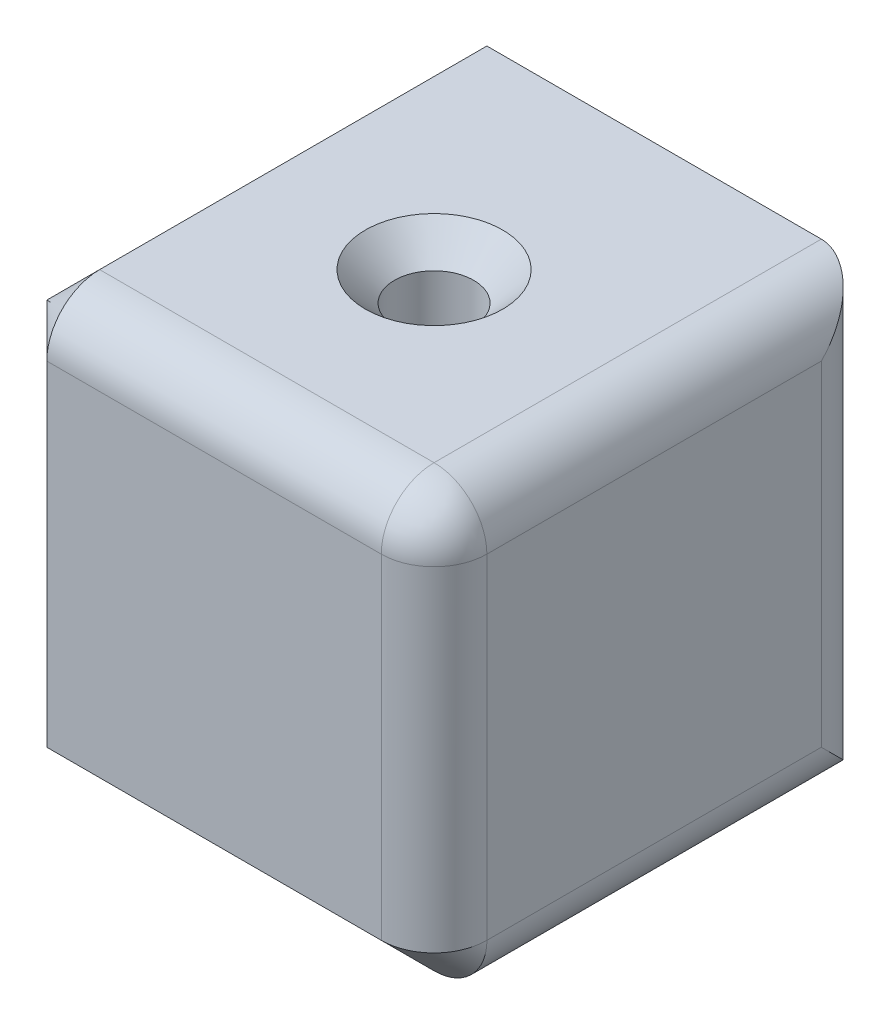
ISO-10303-21;
HEADER;
FILE_DESCRIPTION(('STEP AP214'),'2;1');
FILE_NAME('part.step','',(''),(''),'','','');
FILE_SCHEMA(('AUTOMOTIVE_DESIGN { 1 0 10303 214 1 1 1 1 }'));
ENDSEC;
DATA;
#1=APPLICATION_CONTEXT('core data for automotive mechanical design processes');
#2=APPLICATION_PROTOCOL_DEFINITION('international standard','automotive_design',2000,#1);
#3=PRODUCT_CONTEXT('',#1,'mechanical');
#4=PRODUCT('Part','Part','',(#3));
#5=PRODUCT_RELATED_PRODUCT_CATEGORY('part','',(#4));
#6=PRODUCT_DEFINITION_FORMATION('','',#4);
#7=PRODUCT_DEFINITION_CONTEXT('part definition',#1,'design');
#8=PRODUCT_DEFINITION('design','',#6,#7);
#9=PRODUCT_DEFINITION_SHAPE('','',#8);
#10=(LENGTH_UNIT() NAMED_UNIT(*) SI_UNIT(.MILLI.,.METRE.));
#11=(NAMED_UNIT(*) PLANE_ANGLE_UNIT() SI_UNIT($,.RADIAN.));
#12=(NAMED_UNIT(*) SI_UNIT($,.STERADIAN.) SOLID_ANGLE_UNIT());
#13=UNCERTAINTY_MEASURE_WITH_UNIT(LENGTH_MEASURE(1.E-05),#10,'distance_accuracy_value','');
#14=(GEOMETRIC_REPRESENTATION_CONTEXT(3) GLOBAL_UNCERTAINTY_ASSIGNED_CONTEXT((#13)) GLOBAL_UNIT_ASSIGNED_CONTEXT((#10,
#11,#12)) REPRESENTATION_CONTEXT('',''));
#15=CARTESIAN_POINT('',(0.,0.,0.));
#16=DIRECTION('',(0.,0.,1.));
#17=DIRECTION('',(1.,0.,0.));
#18=AXIS2_PLACEMENT_3D('',#15,#16,#17);
#19=CARTESIAN_POINT('',(0.,0.,25.));
#20=DIRECTION('',(1.,0.,0.));
#21=DIRECTION('',(0.,0.,-1.));
#22=AXIS2_PLACEMENT_3D('',#19,#20,#21);
#23=PLANE('',#22);
#24=DIRECTION('',(0.,0.,-1.));
#25=VECTOR('',#24,1.);
#26=CARTESIAN_POINT('',(0.,22.,25.));
#27=LINE('',#26,#25);
#28=CARTESIAN_POINT('',(0.,22.,22.));
#29=VERTEX_POINT('',#28);
#30=CARTESIAN_POINT('',(0.,22.,2.));
#31=VERTEX_POINT('',#30);
#32=EDGE_CURVE('E391',#29,#31,#27,.T.);
#33=ORIENTED_EDGE('',*,*,#32,.T.);
#34=CARTESIAN_POINT('',(0.,71.9999999999998,2.));
#35=CARTESIAN_POINT('',(0.,56.7333333333332,2.));
#36=CARTESIAN_POINT('',(0.,41.4666666666666,2.));
#37=CARTESIAN_POINT('',(0.,26.2,2.));
#38=CARTESIAN_POINT('',(0.,24.8,2.));
#39=CARTESIAN_POINT('',(0.,23.4,2.));
#40=CARTESIAN_POINT('',(0.,22.,2.));
#41=CARTESIAN_POINT('',(0.,14.6666666666667,2.));
#42=CARTESIAN_POINT('',(0.,7.33333333333329,4.));
#43=CARTESIAN_POINT('',(0.,0.,4.));
#44=CARTESIAN_POINT('',(0.,-0.733333333333367,4.));
#45=CARTESIAN_POINT('',(0.,-1.46666666666673,4.));
#46=CARTESIAN_POINT('',(0.,-2.2000000000001,4.));
#47=CARTESIAN_POINT('',(0.,-17.4666666666666,4.));
#48=CARTESIAN_POINT('',(0.,-32.7333333333331,4.));
#49=CARTESIAN_POINT('',(0.,-47.9999999999996,4.));
#50=(BOUNDED_CURVE() B_SPLINE_CURVE(3,(#34,#35,#36,#37,#38,#39,#40,#41,#42,#43,#44,#45,#46,#47,
#48,#49),.UNSPECIFIED.,.F.,.F.) B_SPLINE_CURVE_WITH_KNOTS((4,3,3,3,3,4),(-1.61267605633802,0.,
0.147887323943662,0.922535211267602,1.,2.61267605633802),
.UNSPECIFIED.) CURVE() GEOMETRIC_REPRESENTATION_ITEM() RATIONAL_B_SPLINE_CURVE((1.,1.,1.,1.,1.,
1.,1.,1.,1.,1.,1.,1.,1.,1.,1.,1.)) REPRESENTATION_ITEM(''));
#51=CARTESIAN_POINT('',(0.,0.,4.));
#52=VERTEX_POINT('',#51);
#53=EDGE_CURVE('E258',#31,#52,#50,.T.);
#54=ORIENTED_EDGE('',*,*,#53,.T.);
#55=DIRECTION('',(0.,0.,-1.));
#56=VECTOR('',#55,1.);
#57=CARTESIAN_POINT('',(0.,0.,25.));
#58=LINE('',#57,#56);
#59=CARTESIAN_POINT('',(0.,0.,22.));
#60=VERTEX_POINT('',#59);
#61=EDGE_CURVE('E156',#60,#52,#58,.T.);
#62=ORIENTED_EDGE('',*,*,#61,.F.);
#63=DIRECTION('',(0.,1.,0.));
#64=VECTOR('',#63,1.);
#65=CARTESIAN_POINT('',(0.,0.,22.));
#66=LINE('',#65,#64);
#67=EDGE_CURVE('E400',#60,#29,#66,.T.);
#68=ORIENTED_EDGE('',*,*,#67,.T.);
#69=EDGE_LOOP('',(#33,#54,#62,#68));
#70=FACE_BOUND('',#69,.T.);
#71=ADVANCED_FACE('F48',(#70),#23,.F.);
#72=CARTESIAN_POINT('',(0.,0.,25.));
#73=DIRECTION('',(0.,1.,0.));
#74=DIRECTION('',(0.,0.,1.));
#75=AXIS2_PLACEMENT_3D('',#72,#73,#74);
#76=PLANE('',#75);
#77=CARTESIAN_POINT('',(12.5,0.,12.5));
#78=DIRECTION('',(0.,1.,0.));
#79=DIRECTION('',(0.,0.,1.));
#80=AXIS2_PLACEMENT_3D('',#77,#78,#79);
#81=CIRCLE('',#80,2.25);
#82=CARTESIAN_POINT('',(12.5,0.,14.75));
#83=VERTEX_POINT('',#82);
#84=EDGE_CURVE('E224',#83,#83,#81,.T.);
#85=ORIENTED_EDGE('',*,*,#84,.T.);
#86=EDGE_LOOP('',(#85));
#87=FACE_BOUND('',#86,.T.);
#88=ORIENTED_EDGE('',*,*,#61,.T.);
#89=CARTESIAN_POINT('',(0.,0.,4.));
#90=CARTESIAN_POINT('',(-1.0780165005591E-05,0.,3.88749351533069));
#91=CARTESIAN_POINT('',(0.00474660216352319,0.,3.77499214031857));
#92=CARTESIAN_POINT('',(0.0237142676639781,0.,3.55079431915907));
#93=CARTESIAN_POINT('',(0.0379240973845999,0.,3.43909783465941));
#94=CARTESIAN_POINT('',(0.075698971357286,0.,3.2173773587357));
#95=CARTESIAN_POINT('',(0.0992569385308707,0.,3.10735216732035));
#96=CARTESIAN_POINT('',(0.155536996447877,0.,2.88970424637514));
#97=CARTESIAN_POINT('',(0.188258975324464,0.,2.78208148753564));
#98=CARTESIAN_POINT('',(0.299906592833125,0.,2.4638552761497));
#99=CARTESIAN_POINT('',(0.392329366770348,0.,2.2578036601231));
#100=CARTESIAN_POINT('',(0.610395015416491,0.,1.86429305281761));
#101=CARTESIAN_POINT('',(0.73603203798121,0.,1.67683079420277));
#102=CARTESIAN_POINT('',(1.01700181102197,0.,1.325628419682));
#103=CARTESIAN_POINT('',(1.17233427169146,0.,1.16188807229434));
#104=CARTESIAN_POINT('',(1.50831732546924,0.,0.862784943115789));
#105=CARTESIAN_POINT('',(1.68897286554306,0.,0.727427719008998));
#106=CARTESIAN_POINT('',(2.07046311746318,0.,0.488943692525064));
#107=CARTESIAN_POINT('',(2.27130176975454,0.,0.38582320009609));
#108=CARTESIAN_POINT('',(2.68740125719416,0.,0.214817855130699));
#109=CARTESIAN_POINT('',(2.90265356163622,0.,0.146912365149823));
#110=CARTESIAN_POINT('',(3.2660192610585,0.,0.0651394785829526));
#111=CARTESIAN_POINT('',(3.41184681111315,0.,0.0407269308072329));
#112=CARTESIAN_POINT('',(3.70509586554667,0.,0.0081593277305874));
#113=CARTESIAN_POINT('',(3.8525148110416,0.,-1.87754480882476E-05));
#114=CARTESIAN_POINT('',(4.,0.,0.));
#115=B_SPLINE_CURVE_WITH_KNOTS('',3,(#89,#90,#91,#92,#93,#94,#95,#96,#97,#98,#99,#100,#101,#102,
#103,#104,#105,#106,#107,#108,#109,#110,#111,#112,#113,#114),.UNSPECIFIED.,.F.,.F.,(4,2,2,2,2,2,
2,2,2,2,2,2,4),(0.,0.337409690213685,0.674803195430493,1.01194176015819,1.34907620955064,
2.0230739401627,2.69695299561842,3.37082547482512,4.04482978167746,4.71896593419016,
5.39270656736782,5.83543557899262,6.27753560189516),.UNSPECIFIED.);
#116=CARTESIAN_POINT('',(4.,0.,0.));
#117=VERTEX_POINT('',#116);
#118=EDGE_CURVE('E79',#52,#117,#115,.T.);
#119=ORIENTED_EDGE('',*,*,#118,.T.);
#120=DIRECTION('',(1.,0.,0.));
#121=VECTOR('',#120,1.);
#122=CARTESIAN_POINT('',(0.,0.,0.));
#123=LINE('',#122,#121);
#124=CARTESIAN_POINT('',(22.,0.,0.));
#125=VERTEX_POINT('',#124);
#126=EDGE_CURVE('E219',#117,#125,#123,.T.);
#127=ORIENTED_EDGE('',*,*,#126,.T.);
#128=DIRECTION('',(0.,0.,-1.));
#129=VECTOR('',#128,1.);
#130=CARTESIAN_POINT('',(22.,0.,25.));
#131=LINE('',#130,#129);
#132=CARTESIAN_POINT('',(22.,0.,22.));
#133=VERTEX_POINT('',#132);
#134=EDGE_CURVE('E143',#125,#133,#131,.F.);
#135=ORIENTED_EDGE('',*,*,#134,.T.);
#136=DIRECTION('',(-1.,0.,0.));
#137=VECTOR('',#136,1.);
#138=CARTESIAN_POINT('',(0.,0.,22.));
#139=LINE('',#138,#137);
#140=EDGE_CURVE('E399',#133,#60,#139,.T.);
#141=ORIENTED_EDGE('',*,*,#140,.T.);
#142=EDGE_LOOP('',(#88,#119,#127,#135,#141));
#143=FACE_BOUND('',#142,.T.);
#144=ADVANCED_FACE('F349',(#87,#143),#76,.F.);
#145=CARTESIAN_POINT('',(25.,0.,25.));
#146=DIRECTION('',(-1.,0.,0.));
#147=DIRECTION('',(0.,0.,1.));
#148=AXIS2_PLACEMENT_3D('',#145,#146,#147);
#149=PLANE('',#148);
#150=DIRECTION('',(0.,1.,0.));
#151=VECTOR('',#150,1.);
#152=CARTESIAN_POINT('',(25.,0.,22.));
#153=LINE('',#152,#151);
#154=CARTESIAN_POINT('',(25.,22.,22.));
#155=VERTEX_POINT('',#154);
#156=CARTESIAN_POINT('',(25.,3.,22.));
#157=VERTEX_POINT('',#156);
#158=EDGE_CURVE('E161',#155,#157,#153,.F.);
#159=ORIENTED_EDGE('',*,*,#158,.T.);
#160=DIRECTION('',(0.,0.,-1.));
#161=VECTOR('',#160,1.);
#162=CARTESIAN_POINT('',(25.,3.,25.));
#163=LINE('',#162,#161);
#164=CARTESIAN_POINT('',(25.,3.,3.));
#165=VERTEX_POINT('',#164);
#166=EDGE_CURVE('E140',#157,#165,#163,.T.);
#167=ORIENTED_EDGE('',*,*,#166,.T.);
#168=DIRECTION('',(0.,1.,0.));
#169=VECTOR('',#168,1.);
#170=CARTESIAN_POINT('',(25.,25.,3.));
#171=LINE('',#170,#169);
#172=CARTESIAN_POINT('',(25.,22.,3.));
#173=VERTEX_POINT('',#172);
#174=EDGE_CURVE('E149',#165,#173,#171,.T.);
#175=ORIENTED_EDGE('',*,*,#174,.T.);
#176=DIRECTION('',(0.,0.,-1.));
#177=VECTOR('',#176,1.);
#178=CARTESIAN_POINT('',(25.,22.,25.));
#179=LINE('',#178,#177);
#180=EDGE_CURVE('E154',#173,#155,#179,.F.);
#181=ORIENTED_EDGE('',*,*,#180,.T.);
#182=EDGE_LOOP('',(#159,#167,#175,#181));
#183=FACE_BOUND('',#182,.T.);
#184=ADVANCED_FACE('F157',(#183),#149,.F.);
#185=CARTESIAN_POINT('',(0.,25.,25.));
#186=DIRECTION('',(0.,-1.,0.));
#187=DIRECTION('',(0.,0.,-1.));
#188=AXIS2_PLACEMENT_3D('',#185,#186,#187);
#189=PLANE('',#188);
#190=CARTESIAN_POINT('',(12.5,25.,12.5));
#191=DIRECTION('',(0.,1.,0.));
#192=DIRECTION('',(0.,0.,1.));
#193=AXIS2_PLACEMENT_3D('',#190,#191,#192);
#194=CIRCLE('',#193,3.9);
#195=CARTESIAN_POINT('',(12.5,25.,16.4));
#196=VERTEX_POINT('',#195);
#197=EDGE_CURVE('E210',#196,#196,#194,.T.);
#198=ORIENTED_EDGE('',*,*,#197,.F.);
#199=EDGE_LOOP('',(#198));
#200=FACE_BOUND('',#199,.T.);
#201=DIRECTION('',(-1.,0.,0.));
#202=VECTOR('',#201,1.);
#203=CARTESIAN_POINT('',(0.,25.,0.));
#204=LINE('',#203,#202);
#205=CARTESIAN_POINT('',(22.,25.,0.));
#206=VERTEX_POINT('',#205);
#207=CARTESIAN_POINT('',(3.00000000000001,25.,0.));
#208=VERTEX_POINT('',#207);
#209=EDGE_CURVE('E216',#206,#208,#204,.T.);
#210=ORIENTED_EDGE('',*,*,#209,.T.);
#211=DIRECTION('',(0.,0.,1.));
#212=VECTOR('',#211,1.);
#213=CARTESIAN_POINT('',(3.00000000000001,25.,25.));
#214=LINE('',#213,#212);
#215=CARTESIAN_POINT('',(3.00000000000001,25.,22.));
#216=VERTEX_POINT('',#215);
#217=EDGE_CURVE('E244',#208,#216,#214,.T.);
#218=ORIENTED_EDGE('',*,*,#217,.T.);
#219=DIRECTION('',(-1.,0.,0.));
#220=VECTOR('',#219,1.);
#221=CARTESIAN_POINT('',(0.,25.,22.));
#222=LINE('',#221,#220);
#223=CARTESIAN_POINT('',(22.,25.,22.));
#224=VERTEX_POINT('',#223);
#225=EDGE_CURVE('E176',#216,#224,#222,.F.);
#226=ORIENTED_EDGE('',*,*,#225,.T.);
#227=DIRECTION('',(0.,0.,-1.));
#228=VECTOR('',#227,1.);
#229=CARTESIAN_POINT('',(22.,25.,25.));
#230=LINE('',#229,#228);
#231=EDGE_CURVE('E188',#224,#206,#230,.T.);
#232=ORIENTED_EDGE('',*,*,#231,.T.);
#233=EDGE_LOOP('',(#210,#218,#226,#232));
#234=FACE_BOUND('',#233,.T.);
#235=ADVANCED_FACE('F240',(#200,#234),#189,.F.);
#236=CARTESIAN_POINT('',(0.,0.,25.));
#237=DIRECTION('',(0.,0.,-1.));
#238=DIRECTION('',(-1.,0.,0.));
#239=AXIS2_PLACEMENT_3D('',#236,#237,#238);
#240=PLANE('',#239);
#241=DIRECTION('',(-1.,0.,0.));
#242=VECTOR('',#241,1.);
#243=CARTESIAN_POINT('',(0.,22.,25.));
#244=LINE('',#243,#242);
#245=CARTESIAN_POINT('',(22.,22.,25.));
#246=VERTEX_POINT('',#245);
#247=CARTESIAN_POINT('',(3.00000000000001,22.,25.));
#248=VERTEX_POINT('',#247);
#249=EDGE_CURVE('E167',#246,#248,#244,.T.);
#250=ORIENTED_EDGE('',*,*,#249,.T.);
#251=DIRECTION('',(0.,-1.,0.));
#252=VECTOR('',#251,1.);
#253=CARTESIAN_POINT('',(3.00000000000001,0.,25.));
#254=LINE('',#253,#252);
#255=CARTESIAN_POINT('',(3.00000000000001,3.00000000000001,25.));
#256=VERTEX_POINT('',#255);
#257=EDGE_CURVE('E389',#248,#256,#254,.T.);
#258=ORIENTED_EDGE('',*,*,#257,.T.);
#259=DIRECTION('',(1.,0.,0.));
#260=VECTOR('',#259,1.);
#261=CARTESIAN_POINT('',(0.,3.00000000000001,25.));
#262=LINE('',#261,#260);
#263=CARTESIAN_POINT('',(22.,3.00000000000001,25.));
#264=VERTEX_POINT('',#263);
#265=EDGE_CURVE('E379',#256,#264,#262,.T.);
#266=ORIENTED_EDGE('',*,*,#265,.T.);
#267=DIRECTION('',(0.,1.,0.));
#268=VECTOR('',#267,1.);
#269=CARTESIAN_POINT('',(22.,0.,25.));
#270=LINE('',#269,#268);
#271=EDGE_CURVE('E174',#264,#246,#270,.T.);
#272=ORIENTED_EDGE('',*,*,#271,.T.);
#273=EDGE_LOOP('',(#250,#258,#266,#272));
#274=FACE_BOUND('',#273,.T.);
#275=ADVANCED_FACE('F238',(#274),#240,.F.);
#276=CARTESIAN_POINT('',(0.,0.,0.));
#277=DIRECTION('',(0.,0.,-1.));
#278=DIRECTION('',(-1.,0.,0.));
#279=AXIS2_PLACEMENT_3D('',#276,#277,#278);
#280=PLANE('',#279);
#281=ORIENTED_EDGE('',*,*,#126,.F.);
#282=CARTESIAN_POINT('',(2.,71.9999999999998,0.));
#283=CARTESIAN_POINT('',(2.,56.7333333333332,0.));
#284=CARTESIAN_POINT('',(2.,41.4666666666666,0.));
#285=CARTESIAN_POINT('',(2.,26.2,0.));
#286=CARTESIAN_POINT('',(2.,24.8,0.));
#287=CARTESIAN_POINT('',(2.,23.4,0.));
#288=CARTESIAN_POINT('',(2.,22.,0.));
#289=CARTESIAN_POINT('',(2.,14.6666666666667,0.));
#290=CARTESIAN_POINT('',(4.,7.33333333333329,0.));
#291=CARTESIAN_POINT('',(4.,0.,0.));
#292=CARTESIAN_POINT('',(4.,-0.733333333333367,0.));
#293=CARTESIAN_POINT('',(4.,-1.46666666666673,0.));
#294=CARTESIAN_POINT('',(4.,-2.2000000000001,0.));
#295=CARTESIAN_POINT('',(4.,-17.4666666666666,0.));
#296=CARTESIAN_POINT('',(4.,-32.7333333333331,0.));
#297=CARTESIAN_POINT('',(4.,-47.9999999999996,0.));
#298=(BOUNDED_CURVE() B_SPLINE_CURVE(3,(#282,#283,#284,#285,#286,#287,#288,#289,#290,#291,#292,
#293,#294,#295,#296,#297),.UNSPECIFIED.,.F.,.F.) B_SPLINE_CURVE_WITH_KNOTS((4,3,3,3,3,4),
(-1.61267605633802,0.,0.147887323943662,0.922535211267602,1.,2.61267605633802),
.UNSPECIFIED.) CURVE() GEOMETRIC_REPRESENTATION_ITEM() RATIONAL_B_SPLINE_CURVE((1.,1.,1.,1.,1.,
1.,1.,1.,1.,1.,1.,1.,1.,1.,1.,1.)) REPRESENTATION_ITEM(''));
#299=CARTESIAN_POINT('',(2.,24.,0.));
#300=VERTEX_POINT('',#299);
#301=EDGE_CURVE('E62',#117,#300,#298,.F.);
#302=ORIENTED_EDGE('',*,*,#301,.T.);
#303=DIRECTION('',(-0.707106781186548,-0.707106781186548,0.));
#304=VECTOR('',#303,1.);
#305=CARTESIAN_POINT('',(-11.,11.,0.));
#306=LINE('',#305,#304);
#307=EDGE_CURVE('E248',#300,#208,#306,.F.);
#308=ORIENTED_EDGE('',*,*,#307,.T.);
#309=ORIENTED_EDGE('',*,*,#209,.F.);
#310=DIRECTION('',(0.,1.,0.));
#311=VECTOR('',#310,1.);
#312=CARTESIAN_POINT('',(22.,0.,0.));
#313=LINE('',#312,#311);
#314=EDGE_CURVE('E189',#206,#125,#313,.F.);
#315=ORIENTED_EDGE('',*,*,#314,.T.);
#316=EDGE_LOOP('',(#281,#302,#308,#309,#315));
#317=FACE_BOUND('',#316,.T.);
#318=ADVANCED_FACE('F430',(#317),#280,.T.);
#319=CARTESIAN_POINT('',(12.5,25.,12.5));
#320=DIRECTION('',(0.,1.,0.));
#321=DIRECTION('',(0.,0.,1.));
#322=AXIS2_PLACEMENT_3D('',#319,#320,#321);
#323=CYLINDRICAL_SURFACE('',#322,2.25);
#324=ORIENTED_EDGE('',*,*,#84,.F.);
#325=EDGE_LOOP('',(#324));
#326=FACE_BOUND('',#325,.T.);
#327=CARTESIAN_POINT('',(12.5,23.35,12.5));
#328=DIRECTION('',(0.,1.,0.));
#329=DIRECTION('',(0.,0.,1.));
#330=AXIS2_PLACEMENT_3D('',#327,#328,#329);
#331=CIRCLE('',#330,2.25);
#332=CARTESIAN_POINT('',(12.5,23.35,14.75));
#333=VERTEX_POINT('',#332);
#334=EDGE_CURVE('E230',#333,#333,#331,.T.);
#335=ORIENTED_EDGE('',*,*,#334,.T.);
#336=EDGE_LOOP('',(#335));
#337=FACE_BOUND('',#336,.T.);
#338=ADVANCED_FACE('F455',(#326,#337),#323,.F.);
#339=CARTESIAN_POINT('',(12.5,25.,12.5));
#340=DIRECTION('',(0.,1.,0.));
#341=DIRECTION('',(0.,0.,1.));
#342=AXIS2_PLACEMENT_3D('',#339,#340,#341);
#343=CONICAL_SURFACE('',#342,3.9,0.785398163397444);
#344=ORIENTED_EDGE('',*,*,#334,.F.);
#345=EDGE_LOOP('',(#344));
#346=FACE_BOUND('',#345,.T.);
#347=ORIENTED_EDGE('',*,*,#197,.T.);
#348=EDGE_LOOP('',(#347));
#349=FACE_BOUND('',#348,.T.);
#350=ADVANCED_FACE('F234',(#346,#349),#343,.F.);
#351=CARTESIAN_POINT('',(0.,22.,22.));
#352=DIRECTION('',(-1.,0.,0.));
#353=DIRECTION('',(0.,0.,1.));
#354=AXIS2_PLACEMENT_3D('',#351,#352,#353);
#355=CYLINDRICAL_SURFACE('',#354,3.);
#356=ORIENTED_EDGE('',*,*,#225,.F.);
#357=CARTESIAN_POINT('',(3.00000000000001,22.,22.));
#358=DIRECTION('',(1.,0.,0.));
#359=DIRECTION('',(0.,0.,-1.));
#360=AXIS2_PLACEMENT_3D('',#357,#358,#359);
#361=CIRCLE('',#360,3.);
#362=EDGE_CURVE('E265',#216,#248,#361,.T.);
#363=ORIENTED_EDGE('',*,*,#362,.T.);
#364=ORIENTED_EDGE('',*,*,#249,.F.);
#365=CARTESIAN_POINT('',(22.,22.,22.));
#366=DIRECTION('',(1.,0.,0.));
#367=DIRECTION('',(0.,0.,-1.));
#368=AXIS2_PLACEMENT_3D('',#365,#366,#367);
#369=CIRCLE('',#368,3.);
#370=EDGE_CURVE('E204',#224,#246,#369,.T.);
#371=ORIENTED_EDGE('',*,*,#370,.F.);
#372=EDGE_LOOP('',(#356,#363,#364,#371));
#373=FACE_BOUND('',#372,.T.);
#374=ADVANCED_FACE('F406',(#373),#355,.T.);
#375=CARTESIAN_POINT('',(22.,22.,22.));
#376=DIRECTION('',(0.,1.,0.));
#377=DIRECTION('',(0.,0.,1.));
#378=AXIS2_PLACEMENT_3D('',#375,#376,#377);
#379=SPHERICAL_SURFACE('',#378,3.);
#380=CARTESIAN_POINT('',(22.,22.,22.));
#381=DIRECTION('',(0.,1.,0.));
#382=DIRECTION('',(0.,0.,1.));
#383=AXIS2_PLACEMENT_3D('',#380,#381,#382);
#384=CIRCLE('',#383,3.);
#385=EDGE_CURVE('E198',#155,#246,#384,.F.);
#386=ORIENTED_EDGE('',*,*,#385,.F.);
#387=CARTESIAN_POINT('',(22.,22.,22.));
#388=DIRECTION('',(0.,0.,1.));
#389=DIRECTION('',(1.,0.,0.));
#390=AXIS2_PLACEMENT_3D('',#387,#388,#389);
#391=CIRCLE('',#390,3.);
#392=EDGE_CURVE('E199',#224,#155,#391,.F.);
#393=ORIENTED_EDGE('',*,*,#392,.F.);
#394=ORIENTED_EDGE('',*,*,#370,.T.);
#395=EDGE_LOOP('',(#386,#393,#394));
#396=FACE_BOUND('',#395,.T.);
#397=ADVANCED_FACE('F422',(#396),#379,.T.);
#398=CARTESIAN_POINT('',(22.,22.,25.));
#399=DIRECTION('',(0.,0.,-1.));
#400=DIRECTION('',(-1.,0.,0.));
#401=AXIS2_PLACEMENT_3D('',#398,#399,#400);
#402=CYLINDRICAL_SURFACE('',#401,3.);
#403=ORIENTED_EDGE('',*,*,#392,.T.);
#404=ORIENTED_EDGE('',*,*,#180,.F.);
#405=CARTESIAN_POINT('',(22.,22.,3.));
#406=DIRECTION('',(0.,-0.707106781186547,-0.707106781186547));
#407=DIRECTION('',(0.,-0.707106781186547,0.707106781186547));
#408=AXIS2_PLACEMENT_3D('',#405,#406,#407);
#409=ELLIPSE('',#408,4.24264068711928,3.);
#410=EDGE_CURVE('E144',#206,#173,#409,.T.);
#411=ORIENTED_EDGE('',*,*,#410,.F.);
#412=ORIENTED_EDGE('',*,*,#231,.F.);
#413=EDGE_LOOP('',(#403,#404,#411,#412));
#414=FACE_BOUND('',#413,.T.);
#415=ADVANCED_FACE('F372',(#414),#402,.T.);
#416=CARTESIAN_POINT('',(22.,0.,22.));
#417=DIRECTION('',(0.,1.,0.));
#418=DIRECTION('',(0.,0.,1.));
#419=AXIS2_PLACEMENT_3D('',#416,#417,#418);
#420=CYLINDRICAL_SURFACE('',#419,3.);
#421=ORIENTED_EDGE('',*,*,#271,.F.);
#422=CARTESIAN_POINT('',(25.,3.,22.));
#423=CARTESIAN_POINT('',(25.,3.,22.2778977561766));
#424=CARTESIAN_POINT('',(24.9603489607797,3.,22.554878178305));
#425=CARTESIAN_POINT('',(24.815474528059,3.,23.0698873511729));
#426=CARTESIAN_POINT('',(24.7109932523984,3.,23.3073564895324));
#427=CARTESIAN_POINT('',(24.4661440043677,3.,23.7253403012141));
#428=CARTESIAN_POINT('',(24.3262255694513,3.,23.9062260862826));
#429=CARTESIAN_POINT('',(24.0347585257967,3.,24.2146740242508));
#430=CARTESIAN_POINT('',(23.883200754588,3.,24.34261059027));
#431=CARTESIAN_POINT('',(23.5809008605497,3.,24.5563688952964));
#432=CARTESIAN_POINT('',(23.4300193540044,3.,24.6423472302576));
#433=CARTESIAN_POINT('',(23.1331336914065,3.,24.7826178816856));
#434=CARTESIAN_POINT('',(22.9870236855326,3.,24.8369397553792));
#435=CARTESIAN_POINT('',(22.5557143683683,3.,24.9632673295877));
#436=CARTESIAN_POINT('',(22.2775127693529,3.,25.));
#437=CARTESIAN_POINT('',(22.,3.,25.));
#438=B_SPLINE_CURVE_WITH_KNOTS('',3,(#422,#423,#424,#425,#426,#427,#428,#429,#430,#431,#432,
#433,#434,#435,#436,#437),.UNSPECIFIED.,.F.,.F.,(4,2,2,2,2,2,2,4),(1.5707963267949,
1.76714586764426,1.96349540849362,2.15984494934298,2.35619449019235,2.55254403104171,
2.74889357189107,3.14159265358979),.UNSPECIFIED.);
#439=EDGE_CURVE('E330',#264,#157,#438,.F.);
#440=ORIENTED_EDGE('',*,*,#439,.T.);
#441=ORIENTED_EDGE('',*,*,#158,.F.);
#442=ORIENTED_EDGE('',*,*,#385,.T.);
#443=EDGE_LOOP('',(#421,#440,#441,#442));
#444=FACE_BOUND('',#443,.T.);
#445=ADVANCED_FACE('F367',(#444),#420,.T.);
#446=CARTESIAN_POINT('',(22.,0.,3.));
#447=DIRECTION('',(0.,-1.,0.));
#448=DIRECTION('',(0.,0.,-1.));
#449=AXIS2_PLACEMENT_3D('',#446,#447,#448);
#450=CYLINDRICAL_SURFACE('',#449,3.);
#451=ORIENTED_EDGE('',*,*,#410,.T.);
#452=ORIENTED_EDGE('',*,*,#174,.F.);
#453=CARTESIAN_POINT('',(22.,3.,3.));
#454=DIRECTION('',(0.,-0.707106781186547,0.707106781186547));
#455=DIRECTION('',(0.,-0.707106781186547,-0.707106781186547));
#456=AXIS2_PLACEMENT_3D('',#453,#454,#455);
#457=ELLIPSE('',#456,4.24264068711928,3.);
#458=EDGE_CURVE('E131',#125,#165,#457,.T.);
#459=ORIENTED_EDGE('',*,*,#458,.F.);
#460=ORIENTED_EDGE('',*,*,#314,.F.);
#461=EDGE_LOOP('',(#451,#452,#459,#460));
#462=FACE_BOUND('',#461,.T.);
#463=ADVANCED_FACE('F147',(#462),#450,.T.);
#464=CARTESIAN_POINT('',(22.,3.,25.));
#465=DIRECTION('',(0.,0.,-1.));
#466=DIRECTION('',(-1.,0.,0.));
#467=AXIS2_PLACEMENT_3D('',#464,#465,#466);
#468=CYLINDRICAL_SURFACE('',#467,3.);
#469=ORIENTED_EDGE('',*,*,#166,.F.);
#470=CARTESIAN_POINT('',(22.,0.,22.));
#471=CARTESIAN_POINT('',(22.2775127693524,0.,22.));
#472=CARTESIAN_POINT('',(22.555714368369,0.0367326704125492,22.));
#473=CARTESIAN_POINT('',(22.9870236855322,0.163060244620709,22.));
#474=CARTESIAN_POINT('',(23.1331336914065,0.217382118314373,22.));
#475=CARTESIAN_POINT('',(23.4300193540044,0.357652769742398,22.));
#476=CARTESIAN_POINT('',(23.5809008605494,0.443631104703368,22.));
#477=CARTESIAN_POINT('',(23.8832007545883,0.657389409730261,22.));
#478=CARTESIAN_POINT('',(24.0347585257966,0.785325975749095,22.));
#479=CARTESIAN_POINT('',(24.3262255694515,1.09377391371752,22.));
#480=CARTESIAN_POINT('',(24.4661440043678,1.2746596987861,22.));
#481=CARTESIAN_POINT('',(24.7109932523983,1.69264351046735,22.));
#482=CARTESIAN_POINT('',(24.8154745280589,1.93011264882701,22.));
#483=CARTESIAN_POINT('',(24.9603489607798,2.44512182169513,22.));
#484=CARTESIAN_POINT('',(25.,2.72210224382335,22.));
#485=CARTESIAN_POINT('',(25.,2.99999999999999,22.));
#486=B_SPLINE_CURVE_WITH_KNOTS('',3,(#470,#471,#472,#473,#474,#475,#476,#477,#478,#479,#480,
#481,#482,#483,#484,#485),.UNSPECIFIED.,.F.,.F.,(4,2,2,2,2,2,2,4),(1.5707963267949,
1.96349540849362,2.15984494934298,2.35619449019235,2.55254403104171,2.74889357189107,
2.94524311274043,3.14159265358979),.UNSPECIFIED.);
#487=EDGE_CURVE('E194',#157,#133,#486,.F.);
#488=ORIENTED_EDGE('',*,*,#487,.T.);
#489=ORIENTED_EDGE('',*,*,#134,.F.);
#490=ORIENTED_EDGE('',*,*,#458,.T.);
#491=EDGE_LOOP('',(#469,#488,#489,#490));
#492=FACE_BOUND('',#491,.T.);
#493=ADVANCED_FACE('F132',(#492),#468,.T.);
#494=CARTESIAN_POINT('',(0.,22.,25.));
#495=DIRECTION('',(0.707106781186547,-0.707106781186547,0.));
#496=DIRECTION('',(0.,0.,-1.));
#497=AXIS2_PLACEMENT_3D('',#494,#495,#496);
#498=PLANE('',#497);
#499=ORIENTED_EDGE('',*,*,#307,.F.);
#500=CARTESIAN_POINT('',(2.,24.,0.));
#501=CARTESIAN_POINT('',(1.92345690442126,23.9234569044213,2.13639570937549E-05));
#502=CARTESIAN_POINT('',(1.84690398359838,23.8469039835984,0.004395706690407));
#503=CARTESIAN_POINT('',(1.69420371855177,23.6942037185518,0.0220142367222185));
#504=CARTESIAN_POINT('',(1.61805709702651,23.6180570970265,0.0352709024243064));
#505=CARTESIAN_POINT('',(1.46607034462464,23.4660703446246,0.0709933698894861));
#506=CARTESIAN_POINT('',(1.39024057186346,23.3902405718634,0.093548353689188));
#507=CARTESIAN_POINT('',(1.24036607744019,23.2403660774402,0.148159234443699));
#508=CARTESIAN_POINT('',(1.16632018368858,23.1663201836886,0.180208698205767));
#509=CARTESIAN_POINT('',(0.992048022382895,22.9920480223829,0.268814982553961));
#510=CARTESIAN_POINT('',(0.892979166350521,22.8929791663505,0.330052970653744));
#511=CARTESIAN_POINT('',(0.702814826964722,22.7028148269647,0.473105817546007));
#512=CARTESIAN_POINT('',(0.611692991702823,22.6116929917028,0.554848891164324));
#513=CARTESIAN_POINT('',(0.46341931089744,22.4634193108974,0.716398034699704));
#514=CARTESIAN_POINT('',(0.403575253454641,22.4035752534546,0.791242366387041));
#515=CARTESIAN_POINT('',(0.292904720430643,22.2929047204306,0.953373965033103));
#516=CARTESIAN_POINT('',(0.242069583584455,22.2420695835844,1.04064913361433));
#517=CARTESIAN_POINT('',(0.161607304615358,22.1616073046153,1.20809567047191));
#518=CARTESIAN_POINT('',(0.129770280637907,22.1297702806379,1.28613468539033));
#519=CARTESIAN_POINT('',(0.0756483336774634,22.0756483336775,1.44849886587949));
#520=CARTESIAN_POINT('',(0.0533422809674708,22.0533422809675,1.53280963451476));
#521=CARTESIAN_POINT('',(0.0245781301855627,22.0245781301856,1.68111614504291));
#522=CARTESIAN_POINT('',(0.0154171847956287,22.0154171847956,1.74407121321037));
#523=CARTESIAN_POINT('',(0.00619663731488541,22.0061966373149,1.83945435154519));
#524=CARTESIAN_POINT('',(0.00387652247309699,22.0038765224731,1.87146513504204));
#525=CARTESIAN_POINT('',(0.000776859581325692,22.0007768595813,1.93564784113807));
#526=CARTESIAN_POINT('',(-2.0884271456029E-06,21.9999979115728,1.96781982161266));
#527=CARTESIAN_POINT('',(0.,22.,2.));
#528=B_SPLINE_CURVE_WITH_KNOTS('',3,(#500,#501,#502,#503,#504,#505,#506,#507,#508,#509,#510,
#511,#512,#513,#514,#515,#516,#517,#518,#519,#520,#521,#522,#523,#524,#525,#526,#527),
.UNSPECIFIED.,.F.,.F.,(4,2,2,2,2,2,2,2,2,2,2,2,2,4),(0.,0.324678292863484,0.649813671710386,
0.978142849801989,1.30625006812495,1.76340565792233,2.21898262228021,2.55679070908053,
2.89427224084831,3.16350889604059,3.43214552932637,3.62439231339299,3.72086064409769,
3.81736652662336),.UNSPECIFIED.);
#529=EDGE_CURVE('E11',#300,#31,#528,.T.);
#530=ORIENTED_EDGE('',*,*,#529,.T.);
#531=ORIENTED_EDGE('',*,*,#32,.F.);
#532=DIRECTION('',(-0.707106781186547,-0.707106781186547,0.));
#533=VECTOR('',#532,1.);
#534=CARTESIAN_POINT('',(3.00000000000001,25.,22.));
#535=LINE('',#534,#533);
#536=EDGE_CURVE('E148',#216,#29,#535,.T.);
#537=ORIENTED_EDGE('',*,*,#536,.F.);
#538=ORIENTED_EDGE('',*,*,#217,.F.);
#539=EDGE_LOOP('',(#499,#530,#531,#537,#538));
#540=FACE_BOUND('',#539,.T.);
#541=ADVANCED_FACE('F246',(#540),#498,.F.);
#542=CARTESIAN_POINT('',(3.00000000000001,22.,22.));
#543=DIRECTION('',(1.,0.,0.));
#544=DIRECTION('',(0.,0.,-1.));
#545=AXIS2_PLACEMENT_3D('',#542,#543,#544);
#546=CONICAL_SURFACE('',#545,3.00000000000001,0.785398163397448);
#547=ORIENTED_EDGE('',*,*,#362,.F.);
#548=ORIENTED_EDGE('',*,*,#536,.T.);
#549=DIRECTION('',(-0.707106781186547,0.,-0.707106781186547));
#550=VECTOR('',#549,1.);
#551=CARTESIAN_POINT('',(3.00000000000001,22.,25.));
#552=LINE('',#551,#550);
#553=EDGE_CURVE('E269',#248,#29,#552,.T.);
#554=ORIENTED_EDGE('',*,*,#553,.F.);
#555=EDGE_LOOP('',(#547,#548,#554));
#556=FACE_BOUND('',#555,.T.);
#557=ADVANCED_FACE('F417',(#556),#546,.T.);
#558=CARTESIAN_POINT('',(3.00000000000001,0.,25.));
#559=DIRECTION('',(0.707106781186547,0.,-0.707106781186547));
#560=DIRECTION('',(0.,-1.,0.));
#561=AXIS2_PLACEMENT_3D('',#558,#559,#560);
#562=PLANE('',#561);
#563=ORIENTED_EDGE('',*,*,#553,.T.);
#564=ORIENTED_EDGE('',*,*,#67,.F.);
#565=DIRECTION('',(-0.577350269189626,-0.577350269189626,-0.577350269189626));
#566=VECTOR('',#565,1.);
#567=CARTESIAN_POINT('',(2.00000000000001,2.00000000000001,24.));
#568=LINE('',#567,#566);
#569=EDGE_CURVE('E266',#256,#60,#568,.T.);
#570=ORIENTED_EDGE('',*,*,#569,.F.);
#571=ORIENTED_EDGE('',*,*,#257,.F.);
#572=EDGE_LOOP('',(#563,#564,#570,#571));
#573=FACE_BOUND('',#572,.T.);
#574=ADVANCED_FACE('F307',(#573),#562,.F.);
#575=CARTESIAN_POINT('',(0.,3.00000000000001,25.));
#576=DIRECTION('',(0.,0.707106781186547,-0.707106781186547));
#577=DIRECTION('',(1.,0.,0.));
#578=AXIS2_PLACEMENT_3D('',#575,#576,#577);
#579=PLANE('',#578);
#580=ORIENTED_EDGE('',*,*,#569,.T.);
#581=ORIENTED_EDGE('',*,*,#140,.F.);
#582=CARTESIAN_POINT('',(22.,3.,25.));
#583=CARTESIAN_POINT('',(22.,0.,22.));
#584=B_SPLINE_CURVE_WITH_KNOTS('',1,(#582,#583),.UNSPECIFIED.,.F.,.F.,(2,2),(0.,1.),.UNSPECIFIED.);
#585=EDGE_CURVE('E271',#264,#133,#584,.T.);
#586=ORIENTED_EDGE('',*,*,#585,.F.);
#587=ORIENTED_EDGE('',*,*,#265,.F.);
#588=EDGE_LOOP('',(#580,#581,#586,#587));
#589=FACE_BOUND('',#588,.T.);
#590=ADVANCED_FACE('F301',(#589),#579,.F.);
#591=CARTESIAN_POINT('',(25.,2.99999999999999,22.));
#592=CARTESIAN_POINT('',(25.,2.72210224382335,22.));
#593=CARTESIAN_POINT('',(24.9603489607798,2.44512182169513,22.));
#594=CARTESIAN_POINT('',(24.8154745280589,1.93011264882701,22.));
#595=CARTESIAN_POINT('',(24.7109932523983,1.69264351046735,22.));
#596=CARTESIAN_POINT('',(24.4661440043678,1.2746596987861,22.));
#597=CARTESIAN_POINT('',(24.3262255694515,1.09377391371752,22.));
#598=CARTESIAN_POINT('',(24.0347585257966,0.785325975749095,22.));
#599=CARTESIAN_POINT('',(23.8832007545883,0.657389409730261,22.));
#600=CARTESIAN_POINT('',(23.5809008605494,0.443631104703368,22.));
#601=CARTESIAN_POINT('',(23.4300193540044,0.357652769742398,22.));
#602=CARTESIAN_POINT('',(23.1331336914065,0.217382118314373,22.));
#603=CARTESIAN_POINT('',(22.9870236855322,0.163060244620709,22.));
#604=CARTESIAN_POINT('',(22.555714368369,0.0367326704125492,22.));
#605=CARTESIAN_POINT('',(22.2775127693524,0.,22.));
#606=CARTESIAN_POINT('',(22.,0.,22.));
#607=CARTESIAN_POINT('',(25.,3.,22.));
#608=CARTESIAN_POINT('',(25.,3.,22.2778977561766));
#609=CARTESIAN_POINT('',(24.9603489607797,3.,22.554878178305));
#610=CARTESIAN_POINT('',(24.815474528059,3.,23.0698873511729));
#611=CARTESIAN_POINT('',(24.7109932523984,3.,23.3073564895324));
#612=CARTESIAN_POINT('',(24.4661440043677,3.,23.7253403012141));
#613=CARTESIAN_POINT('',(24.3262255694513,3.,23.9062260862826));
#614=CARTESIAN_POINT('',(24.0347585257967,3.,24.2146740242508));
#615=CARTESIAN_POINT('',(23.883200754588,3.,24.34261059027));
#616=CARTESIAN_POINT('',(23.5809008605497,3.,24.5563688952964));
#617=CARTESIAN_POINT('',(23.4300193540044,3.,24.6423472302576));
#618=CARTESIAN_POINT('',(23.1331336914065,3.,24.7826178816856));
#619=CARTESIAN_POINT('',(22.9870236855326,3.,24.8369397553792));
#620=CARTESIAN_POINT('',(22.5557143683683,3.,24.9632673295877));
#621=CARTESIAN_POINT('',(22.2775127693529,3.,25.));
#622=CARTESIAN_POINT('',(22.,3.,25.));
#623=B_SPLINE_SURFACE_WITH_KNOTS('',1,3,((#591,#592,#593,#594,#595,#596,#597,#598,#599,#600,
#601,#602,#603,#604,#605,#606),(#607,#608,#609,#610,#611,#612,#613,#614,#615,#616,#617,#618,
#619,#620,#621,#622)),.UNSPECIFIED.,.F.,.F.,.F.,(2,2),(4,2,2,2,2,2,2,4),(0.,1.),
(1.5707963267949,1.76714586764426,1.96349540849362,2.15984494934298,2.35619449019235,
2.55254403104171,2.74889357189107,3.14159265358979),.UNSPECIFIED.);
#624=ORIENTED_EDGE('',*,*,#487,.F.);
#625=ORIENTED_EDGE('',*,*,#439,.F.);
#626=ORIENTED_EDGE('',*,*,#585,.T.);
#627=EDGE_LOOP('',(#624,#625,#626));
#628=FACE_BOUND('',#627,.T.);
#629=ADVANCED_FACE('F286',(#628),#623,.T.);
#630=CARTESIAN_POINT('',(0.,28.9728,2.));
#631=CARTESIAN_POINT('',(0.,28.0485333333333,2.));
#632=CARTESIAN_POINT('',(0.,27.1242666666667,2.));
#633=CARTESIAN_POINT('',(0.,26.2,2.));
#634=CARTESIAN_POINT('',(0.,24.8,2.));
#635=CARTESIAN_POINT('',(0.,23.4,2.));
#636=CARTESIAN_POINT('',(0.,22.,2.));
#637=CARTESIAN_POINT('',(0.,14.6666666666667,2.));
#638=CARTESIAN_POINT('',(0.,7.33333333333329,4.));
#639=CARTESIAN_POINT('',(0.,0.,4.));
#640=CARTESIAN_POINT('',(0.,-0.733333333333367,4.));
#641=CARTESIAN_POINT('',(0.,-1.46666666666673,4.));
#642=CARTESIAN_POINT('',(0.,-2.2000000000001,4.));
#643=CARTESIAN_POINT('',(0.,-3.07626666666672,4.));
#644=CARTESIAN_POINT('',(0.,-3.95253333333334,4.));
#645=CARTESIAN_POINT('',(0.,-4.82879999999996,4.));
#646=CARTESIAN_POINT('',(0.,28.9728,0.));
#647=CARTESIAN_POINT('',(0.,28.0485333333333,0.));
#648=CARTESIAN_POINT('',(0.,27.1242666666667,0.));
#649=CARTESIAN_POINT('',(0.,26.2,0.));
#650=CARTESIAN_POINT('',(0.,24.8,0.));
#651=CARTESIAN_POINT('',(0.,23.4,0.));
#652=CARTESIAN_POINT('',(0.,22.,0.));
#653=CARTESIAN_POINT('',(0.,14.6666666666667,0.));
#654=CARTESIAN_POINT('',(0.,7.33333333333329,0.));
#655=CARTESIAN_POINT('',(0.,0.,0.));
#656=CARTESIAN_POINT('',(0.,-0.733333333333367,0.));
#657=CARTESIAN_POINT('',(0.,-1.46666666666673,0.));
#658=CARTESIAN_POINT('',(0.,-2.2000000000001,0.));
#659=CARTESIAN_POINT('',(0.,-3.07626666666672,0.));
#660=CARTESIAN_POINT('',(0.,-3.95253333333334,0.));
#661=CARTESIAN_POINT('',(0.,-4.82879999999996,0.));
#662=CARTESIAN_POINT('',(2.,28.9728,0.));
#663=CARTESIAN_POINT('',(2.,28.0485333333333,0.));
#664=CARTESIAN_POINT('',(2.,27.1242666666667,0.));
#665=CARTESIAN_POINT('',(2.,26.2,0.));
#666=CARTESIAN_POINT('',(2.,24.8,0.));
#667=CARTESIAN_POINT('',(2.,23.4,0.));
#668=CARTESIAN_POINT('',(2.,22.,0.));
#669=CARTESIAN_POINT('',(2.,14.6666666666667,0.));
#670=CARTESIAN_POINT('',(4.,7.33333333333329,0.));
#671=CARTESIAN_POINT('',(4.,0.,0.));
#672=CARTESIAN_POINT('',(4.,-0.733333333333367,0.));
#673=CARTESIAN_POINT('',(4.,-1.46666666666673,0.));
#674=CARTESIAN_POINT('',(4.,-2.2000000000001,0.));
#675=CARTESIAN_POINT('',(4.,-3.07626666666672,0.));
#676=CARTESIAN_POINT('',(4.,-3.95253333333334,0.));
#677=CARTESIAN_POINT('',(4.,-4.82879999999996,0.));
#678=(BOUNDED_SURFACE() B_SPLINE_SURFACE(2,3,((#630,#631,#632,#633,#634,#635,#636,#637,#638,
#639,#640,#641,#642,#643,#644,#645),(#646,#647,#648,#649,#650,#651,#652,#653,#654,#655,#656,
#657,#658,#659,#660,#661),(#662,#663,#664,#665,#666,#667,#668,#669,#670,#671,#672,#673,#674,
#675,#676,#677)),.UNSPECIFIED.,.F.,.F.,.F.) B_SPLINE_SURFACE_WITH_KNOTS((3,3),(4,3,3,3,3,4),(0.,
1.),(-0.0976338028169011,0.,0.147887323943662,0.922535211267602,1.,1.09256338028169),
.UNSPECIFIED.) GEOMETRIC_REPRESENTATION_ITEM() RATIONAL_B_SPLINE_SURFACE(((1.,1.,1.,1.,1.,1.,1.,
1.,1.,1.,1.,1.,1.,1.,1.,1.),(0.707106781186548,0.707106781186548,0.707106781186548,
0.707106781186548,0.707106781186548,0.707106781186548,0.707106781186548,0.707106781186548,
0.707106781186548,0.707106781186548,0.707106781186548,0.707106781186548,0.707106781186548,
0.707106781186548,0.707106781186548,0.707106781186548),(1.,1.,1.,1.,1.,1.,1.,1.,1.,1.,1.,1.,1.,
1.,1.,1.))) REPRESENTATION_ITEM('') SURFACE());
#679=ORIENTED_EDGE('',*,*,#529,.F.);
#680=ORIENTED_EDGE('',*,*,#301,.F.);
#681=ORIENTED_EDGE('',*,*,#118,.F.);
#682=ORIENTED_EDGE('',*,*,#53,.F.);
#683=EDGE_LOOP('',(#679,#680,#681,#682));
#684=FACE_BOUND('',#683,.T.);
#685=ADVANCED_FACE('F51',(#684),#678,.T.);
#686=CLOSED_SHELL('',(#71,#144,#184,#235,#275,#318,#338,#350,#374,#397,#415,#445,#463,#493,#541,
#557,#574,#590,#629,#685));
#687=MANIFOLD_SOLID_BREP('B2',#686);
#688=ADVANCED_BREP_SHAPE_REPRESENTATION('',(#18,#687),#14);
#689=SHAPE_DEFINITION_REPRESENTATION(#9,#688);
ENDSEC;
END-ISO-10303-21;
